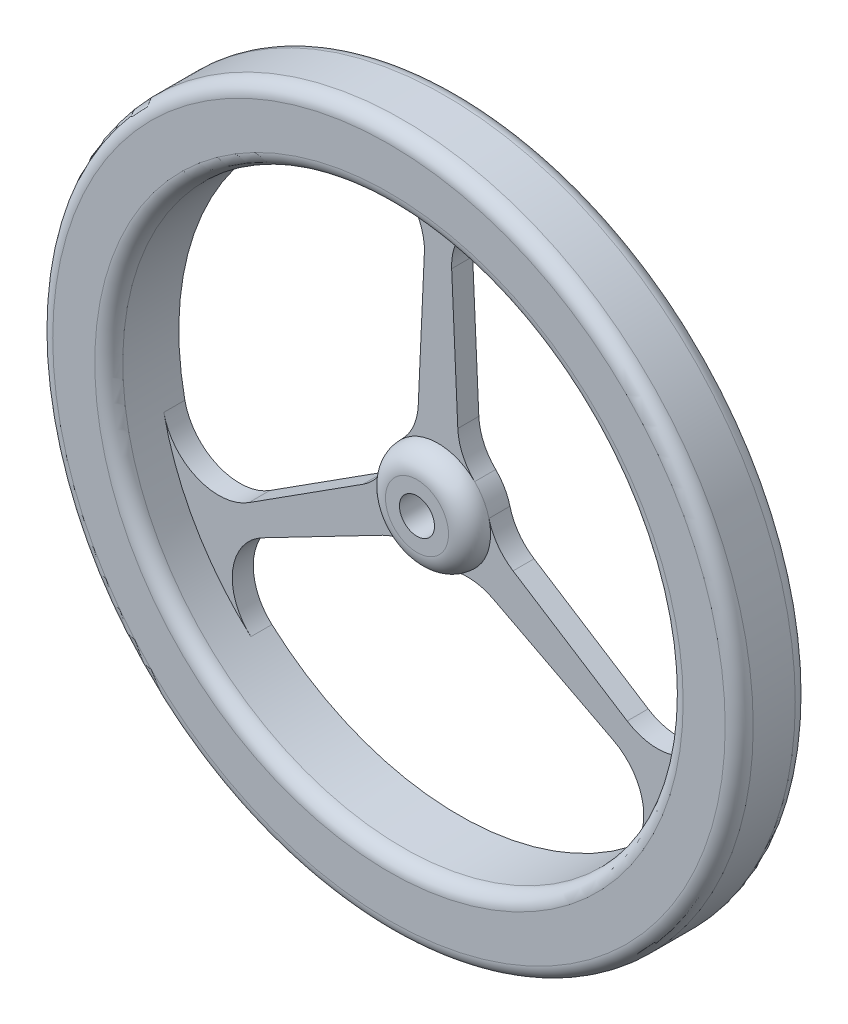
ISO-10303-21;
HEADER;
FILE_DESCRIPTION(('STEP AP214'),'2;1');
FILE_NAME('part.step','',(''),(''),'','','');
FILE_SCHEMA(('AUTOMOTIVE_DESIGN { 1 0 10303 214 1 1 1 1 }'));
ENDSEC;
DATA;
#1=APPLICATION_CONTEXT('core data for automotive mechanical design processes');
#2=APPLICATION_PROTOCOL_DEFINITION('international standard','automotive_design',2000,#1);
#3=PRODUCT_CONTEXT('',#1,'mechanical');
#4=PRODUCT('Part','Part','',(#3));
#5=PRODUCT_RELATED_PRODUCT_CATEGORY('part','',(#4));
#6=PRODUCT_DEFINITION_FORMATION('','',#4);
#7=PRODUCT_DEFINITION_CONTEXT('part definition',#1,'design');
#8=PRODUCT_DEFINITION('design','',#6,#7);
#9=PRODUCT_DEFINITION_SHAPE('','',#8);
#10=(LENGTH_UNIT() NAMED_UNIT(*) SI_UNIT(.MILLI.,.METRE.));
#11=(NAMED_UNIT(*) PLANE_ANGLE_UNIT() SI_UNIT($,.RADIAN.));
#12=(NAMED_UNIT(*) SI_UNIT($,.STERADIAN.) SOLID_ANGLE_UNIT());
#13=UNCERTAINTY_MEASURE_WITH_UNIT(LENGTH_MEASURE(1.E-05),#10,'distance_accuracy_value','');
#14=(GEOMETRIC_REPRESENTATION_CONTEXT(3) GLOBAL_UNCERTAINTY_ASSIGNED_CONTEXT((#13)) GLOBAL_UNIT_ASSIGNED_CONTEXT((#10,
#11,#12)) REPRESENTATION_CONTEXT('',''));
#15=CARTESIAN_POINT('',(0.,0.,0.));
#16=DIRECTION('',(0.,0.,1.));
#17=DIRECTION('',(1.,0.,0.));
#18=AXIS2_PLACEMENT_3D('',#15,#16,#17);
#19=CARTESIAN_POINT('',(0.,0.,6.));
#20=DIRECTION('',(0.,0.,-1.));
#21=DIRECTION('',(-1.,0.,0.));
#22=AXIS2_PLACEMENT_3D('',#19,#20,#21);
#23=CYLINDRICAL_SURFACE('',#22,7.5);
#24=DIRECTION('',(0.,0.,-1.));
#25=VECTOR('',#24,1.);
#26=CARTESIAN_POINT('',(2.03527367774959,-7.21856364221163,6.));
#27=LINE('',#26,#25);
#28=CARTESIAN_POINT('',(2.03527367774959,-7.21856364221163,0.));
#29=VERTEX_POINT('',#28);
#30=CARTESIAN_POINT('',(2.03527367774959,-7.21856364221163,3.));
#31=VERTEX_POINT('',#30);
#32=EDGE_CURVE('E321',#29,#31,#27,.F.);
#33=ORIENTED_EDGE('',*,*,#32,.T.);
#34=CARTESIAN_POINT('',(0.,0.,3.));
#35=DIRECTION('',(0.,0.,1.));
#36=DIRECTION('',(1.,0.,0.));
#37=AXIS2_PLACEMENT_3D('',#34,#35,#36);
#38=CIRCLE('',#37,7.5);
#39=CARTESIAN_POINT('',(-2.03527367774982,-7.21856364221157,3.));
#40=VERTEX_POINT('',#39);
#41=EDGE_CURVE('E388',#31,#40,#38,.F.);
#42=ORIENTED_EDGE('',*,*,#41,.T.);
#43=DIRECTION('',(0.,0.,-1.));
#44=VECTOR('',#43,1.);
#45=CARTESIAN_POINT('',(-2.03527367774982,-7.21856364221157,6.));
#46=LINE('',#45,#44);
#47=CARTESIAN_POINT('',(-2.03527367774982,-7.21856364221157,0.));
#48=VERTEX_POINT('',#47);
#49=EDGE_CURVE('E318',#40,#48,#46,.T.);
#50=ORIENTED_EDGE('',*,*,#49,.T.);
#51=CARTESIAN_POINT('',(0.,0.,0.));
#52=DIRECTION('',(0.,0.,1.));
#53=DIRECTION('',(1.,0.,0.));
#54=AXIS2_PLACEMENT_3D('',#51,#52,#53);
#55=CIRCLE('',#54,7.5);
#56=EDGE_CURVE('E252',#48,#29,#55,.T.);
#57=ORIENTED_EDGE('',*,*,#56,.T.);
#58=EDGE_LOOP('',(#33,#42,#50,#57));
#59=FACE_BOUND('',#58,.T.);
#60=ADVANCED_FACE('F41',(#59),#23,.T.);
#61=DIRECTION('',(0.,0.,-1.));
#62=VECTOR('',#61,1.);
#63=CARTESIAN_POINT('',(-7.2690963318648,1.84668311252085,6.));
#64=LINE('',#63,#62);
#65=CARTESIAN_POINT('',(-7.2690963318648,1.84668311252085,0.));
#66=VERTEX_POINT('',#65);
#67=CARTESIAN_POINT('',(-7.2690963318648,1.84668311252085,3.));
#68=VERTEX_POINT('',#67);
#69=EDGE_CURVE('E315',#66,#68,#64,.F.);
#70=ORIENTED_EDGE('',*,*,#69,.T.);
#71=CARTESIAN_POINT('',(0.,0.,3.));
#72=DIRECTION('',(0.,0.,1.));
#73=DIRECTION('',(1.,0.,0.));
#74=AXIS2_PLACEMENT_3D('',#71,#72,#73);
#75=CIRCLE('',#74,7.5);
#76=CARTESIAN_POINT('',(-5.2338226541151,5.37188052969084,3.));
#77=VERTEX_POINT('',#76);
#78=EDGE_CURVE('E386',#68,#77,#75,.F.);
#79=ORIENTED_EDGE('',*,*,#78,.T.);
#80=DIRECTION('',(0.,0.,-1.));
#81=VECTOR('',#80,1.);
#82=CARTESIAN_POINT('',(-5.2338226541151,5.37188052969084,6.));
#83=LINE('',#82,#81);
#84=CARTESIAN_POINT('',(-5.2338226541151,5.37188052969084,0.));
#85=VERTEX_POINT('',#84);
#86=EDGE_CURVE('E312',#77,#85,#83,.T.);
#87=ORIENTED_EDGE('',*,*,#86,.T.);
#88=EDGE_CURVE('E253',#85,#66,#55,.T.);
#89=ORIENTED_EDGE('',*,*,#88,.T.);
#90=EDGE_LOOP('',(#70,#79,#87,#89));
#91=FACE_BOUND('',#90,.T.);
#92=ADVANCED_FACE('F422',(#91),#23,.T.);
#93=CARTESIAN_POINT('',(0.,0.,10.));
#94=DIRECTION('',(0.,0.,1.));
#95=DIRECTION('',(1.,0.,0.));
#96=AXIS2_PLACEMENT_3D('',#93,#94,#95);
#97=PLANE('',#96);
#98=CARTESIAN_POINT('',(0.,0.,10.));
#99=DIRECTION('',(0.,0.,1.));
#100=DIRECTION('',(1.,0.,0.));
#101=AXIS2_PLACEMENT_3D('',#98,#99,#100);
#102=CIRCLE('',#101,48.);
#103=CARTESIAN_POINT('',(48.,0.,10.));
#104=VERTEX_POINT('',#103);
#105=EDGE_CURVE('E49',#104,#104,#102,.T.);
#106=ORIENTED_EDGE('',*,*,#105,.T.);
#107=EDGE_LOOP('',(#106));
#108=FACE_BOUND('',#107,.T.);
#109=CARTESIAN_POINT('',(0.,0.,10.));
#110=DIRECTION('',(0.,0.,1.));
#111=DIRECTION('',(1.,0.,0.));
#112=AXIS2_PLACEMENT_3D('',#109,#110,#111);
#113=CIRCLE('',#112,42.);
#114=CARTESIAN_POINT('',(42.,0.,10.));
#115=VERTEX_POINT('',#114);
#116=EDGE_CURVE('E400',#115,#115,#113,.F.);
#117=ORIENTED_EDGE('',*,*,#116,.T.);
#118=EDGE_LOOP('',(#117));
#119=FACE_BOUND('',#118,.T.);
#120=ADVANCED_FACE('F405',(#108,#119),#97,.T.);
#121=CARTESIAN_POINT('',(0.,0.,0.));
#122=DIRECTION('',(0.,0.,1.));
#123=DIRECTION('',(1.,0.,0.));
#124=AXIS2_PLACEMENT_3D('',#121,#122,#123);
#125=PLANE('',#124);
#126=CARTESIAN_POINT('',(0.,0.,0.));
#127=DIRECTION('',(0.,0.,1.));
#128=DIRECTION('',(1.,0.,0.));
#129=AXIS2_PLACEMENT_3D('',#126,#127,#128);
#130=CIRCLE('',#129,48.);
#131=CARTESIAN_POINT('',(48.,0.,0.));
#132=VERTEX_POINT('',#131);
#133=EDGE_CURVE('E397',#132,#132,#130,.F.);
#134=ORIENTED_EDGE('',*,*,#133,.T.);
#135=EDGE_LOOP('',(#134));
#136=FACE_BOUND('',#135,.T.);
#137=DIRECTION('',(0.887777804154205,0.460272278603805,0.));
#138=VECTOR('',#137,1.);
#139=CARTESIAN_POINT('',(1.52266404715864,-2.93692974156858,0.));
#140=LINE('',#139,#138);
#141=CARTESIAN_POINT('',(-25.0532731793852,-16.715340427277,0.));
#142=VERTEX_POINT('',#141);
#143=CARTESIAN_POINT('',(-7.88841049618007,-7.81614242733693,0.));
#144=VERTEX_POINT('',#143);
#145=EDGE_CURVE('E531',#142,#144,#140,.T.);
#146=ORIENTED_EDGE('',*,*,#145,.F.);
#147=CARTESIAN_POINT('',(-21.3710949505548,-23.8175628605106,0.));
#148=DIRECTION('',(0.,0.,1.));
#149=DIRECTION('',(1.,0.,0.));
#150=AXIS2_PLACEMENT_3D('',#147,#148,#149);
#151=CIRCLE('',#150,8.);
#152=CARTESIAN_POINT('',(-26.7138686881934,-29.7719535756382,0.));
#153=VERTEX_POINT('',#152);
#154=EDGE_CURVE('E338',#142,#153,#151,.T.);
#155=ORIENTED_EDGE('',*,*,#154,.T.);
#156=CARTESIAN_POINT('',(0.,0.,0.));
#157=DIRECTION('',(0.,0.,1.));
#158=DIRECTION('',(1.,0.,0.));
#159=AXIS2_PLACEMENT_3D('',#156,#157,#158);
#160=CIRCLE('',#159,40.);
#161=CARTESIAN_POINT('',(26.7138686881928,-29.7719535756388,0.));
#162=VERTEX_POINT('',#161);
#163=EDGE_CURVE('E271',#153,#162,#160,.T.);
#164=ORIENTED_EDGE('',*,*,#163,.T.);
#165=CARTESIAN_POINT('',(21.3710949505543,-23.817562860511,0.));
#166=DIRECTION('',(0.,0.,1.));
#167=DIRECTION('',(1.,0.,0.));
#168=AXIS2_PLACEMENT_3D('',#165,#166,#167);
#169=CIRCLE('',#168,8.);
#170=CARTESIAN_POINT('',(25.0532731793848,-16.7153404272774,0.));
#171=VERTEX_POINT('',#170);
#172=EDGE_CURVE('E333',#162,#171,#169,.T.);
#173=ORIENTED_EDGE('',*,*,#172,.T.);
#174=DIRECTION('',(-0.887777804154199,0.460272278603817,0.));
#175=VECTOR('',#174,1.);
#176=CARTESIAN_POINT('',(-1.52266404715877,-2.93692974156873,0.));
#177=LINE('',#176,#175);
#178=CARTESIAN_POINT('',(7.88841049617969,-7.81614242733712,0.));
#179=VERTEX_POINT('',#178);
#180=EDGE_CURVE('E233',#171,#179,#177,.T.);
#181=ORIENTED_EDGE('',*,*,#180,.T.);
#182=CARTESIAN_POINT('',(4.20623226734915,-14.9183648605707,0.));
#183=DIRECTION('',(0.,0.,1.));
#184=DIRECTION('',(1.,0.,0.));
#185=AXIS2_PLACEMENT_3D('',#182,#183,#184);
#186=CIRCLE('',#185,8.);
#187=EDGE_CURVE('E347',#179,#29,#186,.T.);
#188=ORIENTED_EDGE('',*,*,#187,.T.);
#189=ORIENTED_EDGE('',*,*,#56,.F.);
#190=CARTESIAN_POINT('',(-4.20623226734963,-14.9183648605706,0.));
#191=DIRECTION('',(0.,0.,1.));
#192=DIRECTION('',(1.,0.,0.));
#193=AXIS2_PLACEMENT_3D('',#190,#191,#192);
#194=CIRCLE('',#193,8.);
#195=EDGE_CURVE('E351',#48,#144,#194,.T.);
#196=ORIENTED_EDGE('',*,*,#195,.T.);
#197=EDGE_LOOP('',(#146,#155,#164,#173,#181,#188,#189,#196));
#198=FACE_BOUND('',#197,.T.);
#199=DIRECTION('',(-0.842496388005733,0.538701992011626,0.));
#200=VECTOR('',#199,1.);
#201=CARTESIAN_POINT('',(1.78212374174931,2.78713061705303,0.));
#202=LINE('',#201,#200);
#203=CARTESIAN_POINT('',(27.0025460326192,-13.3391008076609,0.));
#204=VERTEX_POINT('',#203);
#205=CARTESIAN_POINT('',(10.713183149761,-2.92349267150326,0.));
#206=VERTEX_POINT('',#205);
#207=EDGE_CURVE('E221',#204,#206,#202,.T.);
#208=ORIENTED_EDGE('',*,*,#207,.F.);
#209=CARTESIAN_POINT('',(31.3121619687122,-6.59912970361502,0.));
#210=DIRECTION('',(0.,0.,1.));
#211=DIRECTION('',(1.,0.,0.));
#212=AXIS2_PLACEMENT_3D('',#209,#210,#211);
#213=CIRCLE('',#212,8.);
#214=CARTESIAN_POINT('',(39.1402024608902,-8.24891212951877,0.));
#215=VERTEX_POINT('',#214);
#216=EDGE_CURVE('E203',#204,#215,#213,.T.);
#217=ORIENTED_EDGE('',*,*,#216,.T.);
#218=CARTESIAN_POINT('',(12.426333772697,38.0208657051563,0.));
#219=VERTEX_POINT('',#218);
#220=EDGE_CURVE('E265',#215,#219,#160,.T.);
#221=ORIENTED_EDGE('',*,*,#220,.T.);
#222=CARTESIAN_POINT('',(9.94106701815758,30.416692564125,0.));
#223=DIRECTION('',(0.,0.,1.));
#224=DIRECTION('',(1.,0.,0.));
#225=AXIS2_PLACEMENT_3D('',#222,#223,#224);
#226=CIRCLE('',#225,8.);
#227=CARTESIAN_POINT('',(1.9492728532343,30.0544412349373,0.));
#228=VERTEX_POINT('',#227);
#229=EDGE_CURVE('E372',#219,#228,#226,.T.);
#230=ORIENTED_EDGE('',*,*,#229,.T.);
#231=DIRECTION('',(0.0452814161484647,-0.99897427061541,0.));
#232=VECTOR('',#231,1.);
#233=CARTESIAN_POINT('',(3.30478778890798,0.149799124515708,0.));
#234=LINE('',#233,#232);
#235=CARTESIAN_POINT('',(2.82477265358127,10.73963509884,0.));
#236=VERTEX_POINT('',#235);
#237=EDGE_CURVE('E266',#228,#236,#234,.T.);
#238=ORIENTED_EDGE('',*,*,#237,.T.);
#239=CARTESIAN_POINT('',(10.8165668185045,11.1018864280277,0.));
#240=DIRECTION('',(0.,0.,1.));
#241=DIRECTION('',(1.,0.,0.));
#242=AXIS2_PLACEMENT_3D('',#239,#240,#241);
#243=CIRCLE('',#242,8.);
#244=CARTESIAN_POINT('',(5.2338226541151,5.37188052969084,0.));
#245=VERTEX_POINT('',#244);
#246=EDGE_CURVE('E369',#236,#245,#243,.T.);
#247=ORIENTED_EDGE('',*,*,#246,.T.);
#248=CARTESIAN_POINT('',(7.26909633186486,1.84668311252061,0.));
#249=VERTEX_POINT('',#248);
#250=EDGE_CURVE('E246',#249,#245,#55,.T.);
#251=ORIENTED_EDGE('',*,*,#250,.F.);
#252=CARTESIAN_POINT('',(15.022799085854,3.8164784325426,0.));
#253=DIRECTION('',(0.,0.,1.));
#254=DIRECTION('',(1.,0.,0.));
#255=AXIS2_PLACEMENT_3D('',#252,#253,#254);
#256=CIRCLE('',#255,8.);
#257=EDGE_CURVE('E231',#249,#206,#256,.T.);
#258=ORIENTED_EDGE('',*,*,#257,.T.);
#259=EDGE_LOOP('',(#208,#217,#221,#230,#238,#247,#251,#258));
#260=FACE_BOUND('',#259,.T.);
#261=DIRECTION('',(-0.0452814161484647,-0.99897427061541,0.));
#262=VECTOR('',#261,1.);
#263=CARTESIAN_POINT('',(-3.30478778890798,0.149799124515708,0.));
#264=LINE('',#263,#262);
#265=CARTESIAN_POINT('',(-1.9492728532343,30.0544412349373,0.));
#266=VERTEX_POINT('',#265);
#267=CARTESIAN_POINT('',(-2.82477265358127,10.73963509884,0.));
#268=VERTEX_POINT('',#267);
#269=EDGE_CURVE('E258',#266,#268,#264,.T.);
#270=ORIENTED_EDGE('',*,*,#269,.F.);
#271=CARTESIAN_POINT('',(-9.94106701815758,30.416692564125,0.));
#272=DIRECTION('',(0.,0.,1.));
#273=DIRECTION('',(1.,0.,0.));
#274=AXIS2_PLACEMENT_3D('',#271,#272,#273);
#275=CIRCLE('',#274,8.);
#276=CARTESIAN_POINT('',(-12.426333772697,38.0208657051563,0.));
#277=VERTEX_POINT('',#276);
#278=EDGE_CURVE('E377',#266,#277,#275,.T.);
#279=ORIENTED_EDGE('',*,*,#278,.T.);
#280=CARTESIAN_POINT('',(-39.1402024608904,-8.24891212951799,0.));
#281=VERTEX_POINT('',#280);
#282=EDGE_CURVE('E274',#277,#281,#160,.T.);
#283=ORIENTED_EDGE('',*,*,#282,.T.);
#284=CARTESIAN_POINT('',(-31.3121619687123,-6.59912970361439,0.));
#285=DIRECTION('',(0.,0.,1.));
#286=DIRECTION('',(1.,0.,0.));
#287=AXIS2_PLACEMENT_3D('',#284,#285,#286);
#288=CIRCLE('',#287,8.);
#289=CARTESIAN_POINT('',(-27.0025460326194,-13.3391008076603,0.));
#290=VERTEX_POINT('',#289);
#291=EDGE_CURVE('E342',#281,#290,#288,.T.);
#292=ORIENTED_EDGE('',*,*,#291,.T.);
#293=DIRECTION('',(0.84249638800574,0.538701992011614,0.));
#294=VECTOR('',#293,1.);
#295=CARTESIAN_POINT('',(-1.78212374174938,2.78713061705322,0.));
#296=LINE('',#295,#294);
#297=CARTESIAN_POINT('',(-10.713183149761,-2.92349267150284,0.));
#298=VERTEX_POINT('',#297);
#299=EDGE_CURVE('E514',#290,#298,#296,.T.);
#300=ORIENTED_EDGE('',*,*,#299,.T.);
#301=CARTESIAN_POINT('',(-15.0227990858539,3.81647843254309,0.));
#302=DIRECTION('',(0.,0.,1.));
#303=DIRECTION('',(1.,0.,0.));
#304=AXIS2_PLACEMENT_3D('',#301,#302,#303);
#305=CIRCLE('',#304,8.);
#306=EDGE_CURVE('E356',#298,#66,#305,.T.);
#307=ORIENTED_EDGE('',*,*,#306,.T.);
#308=ORIENTED_EDGE('',*,*,#88,.F.);
#309=CARTESIAN_POINT('',(-10.8165668185045,11.1018864280277,0.));
#310=DIRECTION('',(0.,0.,1.));
#311=DIRECTION('',(1.,0.,0.));
#312=AXIS2_PLACEMENT_3D('',#309,#310,#311);
#313=CIRCLE('',#312,8.);
#314=EDGE_CURVE('E360',#85,#268,#313,.T.);
#315=ORIENTED_EDGE('',*,*,#314,.T.);
#316=EDGE_LOOP('',(#270,#279,#283,#292,#300,#307,#308,#315));
#317=FACE_BOUND('',#316,.T.);
#318=CARTESIAN_POINT('',(0.,0.,0.));
#319=DIRECTION('',(0.,0.,1.));
#320=DIRECTION('',(1.,0.,0.));
#321=AXIS2_PLACEMENT_3D('',#318,#319,#320);
#322=CIRCLE('',#321,2.5);
#323=CARTESIAN_POINT('',(2.5,0.,0.));
#324=VERTEX_POINT('',#323);
#325=EDGE_CURVE('E247',#324,#324,#322,.T.);
#326=ORIENTED_EDGE('',*,*,#325,.T.);
#327=EDGE_LOOP('',(#326));
#328=FACE_BOUND('',#327,.T.);
#329=ADVANCED_FACE('F228',(#136,#198,#260,#317,#328),#125,.F.);
#330=CARTESIAN_POINT('',(0.,0.,10.));
#331=DIRECTION('',(0.,0.,-1.));
#332=DIRECTION('',(-1.,0.,0.));
#333=AXIS2_PLACEMENT_3D('',#330,#331,#332);
#334=CYLINDRICAL_SURFACE('',#333,50.);
#335=CARTESIAN_POINT('',(0.,0.,2.));
#336=DIRECTION('',(0.,0.,1.));
#337=DIRECTION('',(1.,0.,0.));
#338=AXIS2_PLACEMENT_3D('',#335,#336,#337);
#339=CIRCLE('',#338,50.);
#340=CARTESIAN_POINT('',(50.,0.,2.));
#341=VERTEX_POINT('',#340);
#342=EDGE_CURVE('E394',#341,#341,#339,.T.);
#343=ORIENTED_EDGE('',*,*,#342,.T.);
#344=EDGE_LOOP('',(#343));
#345=FACE_BOUND('',#344,.T.);
#346=CARTESIAN_POINT('',(0.,0.,8.));
#347=DIRECTION('',(0.,0.,1.));
#348=DIRECTION('',(1.,0.,0.));
#349=AXIS2_PLACEMENT_3D('',#346,#347,#348);
#350=CIRCLE('',#349,50.);
#351=CARTESIAN_POINT('',(50.,0.,8.));
#352=VERTEX_POINT('',#351);
#353=EDGE_CURVE('E391',#352,#352,#350,.F.);
#354=ORIENTED_EDGE('',*,*,#353,.T.);
#355=EDGE_LOOP('',(#354));
#356=FACE_BOUND('',#355,.T.);
#357=ADVANCED_FACE('F606',(#345,#356),#334,.T.);
#358=CARTESIAN_POINT('',(0.,0.,10.));
#359=DIRECTION('',(0.,0.,-1.));
#360=DIRECTION('',(-1.,0.,0.));
#361=AXIS2_PLACEMENT_3D('',#358,#359,#360);
#362=CYLINDRICAL_SURFACE('',#361,40.);
#363=CARTESIAN_POINT('',(0.,0.,8.));
#364=DIRECTION('',(0.,0.,1.));
#365=DIRECTION('',(1.,0.,0.));
#366=AXIS2_PLACEMENT_3D('',#363,#364,#365);
#367=CIRCLE('',#366,40.);
#368=CARTESIAN_POINT('',(40.,0.,8.));
#369=VERTEX_POINT('',#368);
#370=EDGE_CURVE('E12',#369,#369,#367,.T.);
#371=ORIENTED_EDGE('',*,*,#370,.T.);
#372=EDGE_LOOP('',(#371));
#373=FACE_BOUND('',#372,.T.);
#374=ORIENTED_EDGE('',*,*,#220,.F.);
#375=DIRECTION('',(0.,0.,-1.));
#376=VECTOR('',#375,1.);
#377=CARTESIAN_POINT('',(39.1402024608902,-8.24891212951878,10.));
#378=LINE('',#377,#376);
#379=CARTESIAN_POINT('',(39.1402024608902,-8.24891212951877,3.));
#380=VERTEX_POINT('',#379);
#381=EDGE_CURVE('E209',#215,#380,#378,.F.);
#382=ORIENTED_EDGE('',*,*,#381,.T.);
#383=CARTESIAN_POINT('',(0.,0.,3.));
#384=DIRECTION('',(0.,0.,1.));
#385=DIRECTION('',(1.,0.,0.));
#386=AXIS2_PLACEMENT_3D('',#383,#384,#385);
#387=CIRCLE('',#386,40.);
#388=CARTESIAN_POINT('',(26.7138686881928,-29.7719535756388,3.));
#389=VERTEX_POINT('',#388);
#390=EDGE_CURVE('E480',#389,#380,#387,.T.);
#391=ORIENTED_EDGE('',*,*,#390,.F.);
#392=DIRECTION('',(0.,0.,-1.));
#393=VECTOR('',#392,1.);
#394=CARTESIAN_POINT('',(26.7138686881928,-29.7719535756388,10.));
#395=LINE('',#394,#393);
#396=EDGE_CURVE('E287',#389,#162,#395,.T.);
#397=ORIENTED_EDGE('',*,*,#396,.T.);
#398=ORIENTED_EDGE('',*,*,#163,.F.);
#399=DIRECTION('',(0.,0.,-1.));
#400=VECTOR('',#399,1.);
#401=CARTESIAN_POINT('',(-26.7138686881934,-29.7719535756382,10.));
#402=LINE('',#401,#400);
#403=CARTESIAN_POINT('',(-26.7138686881934,-29.7719535756382,3.));
#404=VERTEX_POINT('',#403);
#405=EDGE_CURVE('E284',#153,#404,#402,.F.);
#406=ORIENTED_EDGE('',*,*,#405,.T.);
#407=CARTESIAN_POINT('',(0.,0.,3.));
#408=DIRECTION('',(0.,0.,1.));
#409=DIRECTION('',(1.,0.,0.));
#410=AXIS2_PLACEMENT_3D('',#407,#408,#409);
#411=CIRCLE('',#410,40.);
#412=CARTESIAN_POINT('',(-39.1402024608904,-8.24891212951799,3.));
#413=VERTEX_POINT('',#412);
#414=EDGE_CURVE('E527',#413,#404,#411,.T.);
#415=ORIENTED_EDGE('',*,*,#414,.F.);
#416=DIRECTION('',(0.,0.,-1.));
#417=VECTOR('',#416,1.);
#418=CARTESIAN_POINT('',(-39.1402024608904,-8.24891212951799,10.));
#419=LINE('',#418,#417);
#420=EDGE_CURVE('E281',#413,#281,#419,.T.);
#421=ORIENTED_EDGE('',*,*,#420,.T.);
#422=ORIENTED_EDGE('',*,*,#282,.F.);
#423=DIRECTION('',(0.,0.,-1.));
#424=VECTOR('',#423,1.);
#425=CARTESIAN_POINT('',(-12.426333772697,38.0208657051563,10.));
#426=LINE('',#425,#424);
#427=CARTESIAN_POINT('',(-12.426333772697,38.0208657051563,3.));
#428=VERTEX_POINT('',#427);
#429=EDGE_CURVE('E225',#277,#428,#426,.F.);
#430=ORIENTED_EDGE('',*,*,#429,.T.);
#431=CARTESIAN_POINT('',(0.,0.,3.));
#432=DIRECTION('',(0.,0.,1.));
#433=DIRECTION('',(1.,0.,0.));
#434=AXIS2_PLACEMENT_3D('',#431,#432,#433);
#435=CIRCLE('',#434,40.);
#436=CARTESIAN_POINT('',(12.426333772697,38.0208657051563,3.));
#437=VERTEX_POINT('',#436);
#438=EDGE_CURVE('E260',#437,#428,#435,.T.);
#439=ORIENTED_EDGE('',*,*,#438,.F.);
#440=DIRECTION('',(0.,0.,-1.));
#441=VECTOR('',#440,1.);
#442=CARTESIAN_POINT('',(12.426333772697,38.0208657051563,10.));
#443=LINE('',#442,#441);
#444=EDGE_CURVE('E278',#437,#219,#443,.T.);
#445=ORIENTED_EDGE('',*,*,#444,.T.);
#446=EDGE_LOOP('',(#374,#382,#391,#397,#398,#406,#415,#421,#422,#430,#439,#445));
#447=FACE_BOUND('',#446,.T.);
#448=ADVANCED_FACE('F478',(#373,#447),#362,.F.);
#449=CARTESIAN_POINT('',(3.30478778890798,0.149799124515708,3.));
#450=DIRECTION('',(0.99897427061541,0.0452814161484647,0.));
#451=DIRECTION('',(-0.0452814161484647,0.99897427061541,0.));
#452=AXIS2_PLACEMENT_3D('',#449,#450,#451);
#453=PLANE('',#452);
#454=DIRECTION('',(0.0452814161484647,-0.99897427061541,0.));
#455=VECTOR('',#454,1.);
#456=CARTESIAN_POINT('',(3.30478778890798,0.149799124515708,3.));
#457=LINE('',#456,#455);
#458=CARTESIAN_POINT('',(1.9492728532343,30.0544412349373,3.));
#459=VERTEX_POINT('',#458);
#460=CARTESIAN_POINT('',(2.82477265358127,10.73963509884,3.));
#461=VERTEX_POINT('',#460);
#462=EDGE_CURVE('E257',#459,#461,#457,.T.);
#463=ORIENTED_EDGE('',*,*,#462,.T.);
#464=DIRECTION('',(0.,0.,-1.));
#465=VECTOR('',#464,1.);
#466=CARTESIAN_POINT('',(2.82477265358127,10.73963509884,3.));
#467=LINE('',#466,#465);
#468=EDGE_CURVE('E215',#461,#236,#467,.T.);
#469=ORIENTED_EDGE('',*,*,#468,.T.);
#470=ORIENTED_EDGE('',*,*,#237,.F.);
#471=DIRECTION('',(0.,0.,1.));
#472=VECTOR('',#471,1.);
#473=CARTESIAN_POINT('',(1.9492728532343,30.0544412349373,3.));
#474=LINE('',#473,#472);
#475=EDGE_CURVE('E63',#228,#459,#474,.T.);
#476=ORIENTED_EDGE('',*,*,#475,.T.);
#477=EDGE_LOOP('',(#463,#469,#470,#476));
#478=FACE_BOUND('',#477,.T.);
#479=ADVANCED_FACE('F486',(#478),#453,.T.);
#480=CARTESIAN_POINT('',(-3.30478778890798,0.149799124515708,3.));
#481=DIRECTION('',(0.99897427061541,-0.0452814161484647,0.));
#482=DIRECTION('',(0.0452814161484647,0.99897427061541,0.));
#483=AXIS2_PLACEMENT_3D('',#480,#481,#482);
#484=PLANE('',#483);
#485=ORIENTED_EDGE('',*,*,#269,.T.);
#486=DIRECTION('',(0.,0.,1.));
#487=VECTOR('',#486,1.);
#488=CARTESIAN_POINT('',(-2.82477265358126,10.73963509884,3.));
#489=LINE('',#488,#487);
#490=CARTESIAN_POINT('',(-2.82477265358127,10.73963509884,3.));
#491=VERTEX_POINT('',#490);
#492=EDGE_CURVE('E327',#268,#491,#489,.T.);
#493=ORIENTED_EDGE('',*,*,#492,.T.);
#494=DIRECTION('',(-0.0452814161484647,-0.99897427061541,0.));
#495=VECTOR('',#494,1.);
#496=CARTESIAN_POINT('',(-3.30478778890798,0.149799124515708,3.));
#497=LINE('',#496,#495);
#498=CARTESIAN_POINT('',(-1.9492728532343,30.0544412349373,3.));
#499=VERTEX_POINT('',#498);
#500=EDGE_CURVE('E262',#499,#491,#497,.T.);
#501=ORIENTED_EDGE('',*,*,#500,.F.);
#502=DIRECTION('',(0.,0.,-1.));
#503=VECTOR('',#502,1.);
#504=CARTESIAN_POINT('',(-1.94927285323431,30.0544412349373,3.));
#505=LINE('',#504,#503);
#506=EDGE_CURVE('E324',#499,#266,#505,.T.);
#507=ORIENTED_EDGE('',*,*,#506,.T.);
#508=EDGE_LOOP('',(#485,#493,#501,#507));
#509=FACE_BOUND('',#508,.T.);
#510=ADVANCED_FACE('F506',(#509),#484,.F.);
#511=CARTESIAN_POINT('',(0.,0.,3.));
#512=DIRECTION('',(0.,0.,1.));
#513=DIRECTION('',(1.,0.,0.));
#514=AXIS2_PLACEMENT_3D('',#511,#512,#513);
#515=PLANE('',#514);
#516=CARTESIAN_POINT('',(0.,0.,3.));
#517=DIRECTION('',(0.,0.,1.));
#518=DIRECTION('',(1.,0.,0.));
#519=AXIS2_PLACEMENT_3D('',#516,#517,#518);
#520=CIRCLE('',#519,7.5);
#521=CARTESIAN_POINT('',(5.2338226541151,5.37188052969084,3.));
#522=VERTEX_POINT('',#521);
#523=EDGE_CURVE('E254',#522,#77,#520,.T.);
#524=ORIENTED_EDGE('',*,*,#523,.F.);
#525=CARTESIAN_POINT('',(10.8165668185045,11.1018864280277,3.));
#526=DIRECTION('',(0.,0.,1.));
#527=DIRECTION('',(1.,0.,0.));
#528=AXIS2_PLACEMENT_3D('',#525,#526,#527);
#529=CIRCLE('',#528,8.);
#530=EDGE_CURVE('E56',#522,#461,#529,.F.);
#531=ORIENTED_EDGE('',*,*,#530,.T.);
#532=ORIENTED_EDGE('',*,*,#462,.F.);
#533=CARTESIAN_POINT('',(9.94106701815758,30.416692564125,3.));
#534=DIRECTION('',(0.,0.,1.));
#535=DIRECTION('',(1.,0.,0.));
#536=AXIS2_PLACEMENT_3D('',#533,#534,#535);
#537=CIRCLE('',#536,8.);
#538=EDGE_CURVE('E374',#459,#437,#537,.F.);
#539=ORIENTED_EDGE('',*,*,#538,.T.);
#540=ORIENTED_EDGE('',*,*,#438,.T.);
#541=CARTESIAN_POINT('',(-9.94106701815758,30.416692564125,3.));
#542=DIRECTION('',(0.,0.,1.));
#543=DIRECTION('',(1.,0.,0.));
#544=AXIS2_PLACEMENT_3D('',#541,#542,#543);
#545=CIRCLE('',#544,8.);
#546=EDGE_CURVE('E379',#428,#499,#545,.F.);
#547=ORIENTED_EDGE('',*,*,#546,.T.);
#548=ORIENTED_EDGE('',*,*,#500,.T.);
#549=CARTESIAN_POINT('',(-10.8165668185045,11.1018864280277,3.));
#550=DIRECTION('',(0.,0.,1.));
#551=DIRECTION('',(1.,0.,0.));
#552=AXIS2_PLACEMENT_3D('',#549,#550,#551);
#553=CIRCLE('',#552,8.);
#554=EDGE_CURVE('E362',#491,#77,#553,.F.);
#555=ORIENTED_EDGE('',*,*,#554,.T.);
#556=EDGE_LOOP('',(#524,#531,#532,#539,#540,#547,#548,#555));
#557=FACE_BOUND('',#556,.T.);
#558=ADVANCED_FACE('F443',(#557),#515,.T.);
#559=CARTESIAN_POINT('',(0.,0.,6.));
#560=DIRECTION('',(0.,0.,1.));
#561=DIRECTION('',(1.,0.,0.));
#562=AXIS2_PLACEMENT_3D('',#559,#560,#561);
#563=PLANE('',#562);
#564=CARTESIAN_POINT('',(0.,0.,6.));
#565=DIRECTION('',(0.,0.,1.));
#566=DIRECTION('',(1.,0.,0.));
#567=AXIS2_PLACEMENT_3D('',#564,#565,#566);
#568=CIRCLE('',#567,4.5);
#569=CARTESIAN_POINT('',(4.5,0.,6.));
#570=VERTEX_POINT('',#569);
#571=EDGE_CURVE('E381',#570,#570,#568,.T.);
#572=ORIENTED_EDGE('',*,*,#571,.T.);
#573=EDGE_LOOP('',(#572));
#574=FACE_BOUND('',#573,.T.);
#575=CARTESIAN_POINT('',(0.,0.,6.));
#576=DIRECTION('',(0.,0.,1.));
#577=DIRECTION('',(1.,0.,0.));
#578=AXIS2_PLACEMENT_3D('',#575,#576,#577);
#579=CIRCLE('',#578,2.5);
#580=CARTESIAN_POINT('',(2.5,0.,6.));
#581=VERTEX_POINT('',#580);
#582=EDGE_CURVE('E243',#581,#581,#579,.T.);
#583=ORIENTED_EDGE('',*,*,#582,.F.);
#584=EDGE_LOOP('',(#583));
#585=FACE_BOUND('',#584,.T.);
#586=ADVANCED_FACE('F434',(#574,#585),#563,.T.);
#587=DIRECTION('',(0.,0.,-1.));
#588=VECTOR('',#587,1.);
#589=CARTESIAN_POINT('',(5.2338226541151,5.37188052969084,6.));
#590=LINE('',#589,#588);
#591=EDGE_CURVE('E306',#245,#522,#590,.F.);
#592=ORIENTED_EDGE('',*,*,#591,.T.);
#593=CARTESIAN_POINT('',(0.,0.,3.));
#594=DIRECTION('',(0.,0.,1.));
#595=DIRECTION('',(1.,0.,0.));
#596=AXIS2_PLACEMENT_3D('',#593,#594,#595);
#597=CIRCLE('',#596,7.5);
#598=CARTESIAN_POINT('',(7.26909633186486,1.84668311252061,3.));
#599=VERTEX_POINT('',#598);
#600=EDGE_CURVE('E384',#522,#599,#597,.F.);
#601=ORIENTED_EDGE('',*,*,#600,.T.);
#602=DIRECTION('',(0.,0.,-1.));
#603=VECTOR('',#602,1.);
#604=CARTESIAN_POINT('',(7.26909633186486,1.84668311252061,6.));
#605=LINE('',#604,#603);
#606=EDGE_CURVE('E309',#599,#249,#605,.T.);
#607=ORIENTED_EDGE('',*,*,#606,.T.);
#608=ORIENTED_EDGE('',*,*,#250,.T.);
#609=EDGE_LOOP('',(#592,#601,#607,#608));
#610=FACE_BOUND('',#609,.T.);
#611=ADVANCED_FACE('F425',(#610),#23,.T.);
#612=CARTESIAN_POINT('',(0.,0.,6.));
#613=DIRECTION('',(0.,0.,-1.));
#614=DIRECTION('',(-1.,0.,0.));
#615=AXIS2_PLACEMENT_3D('',#612,#613,#614);
#616=CYLINDRICAL_SURFACE('',#615,2.5);
#617=ORIENTED_EDGE('',*,*,#582,.T.);
#618=EDGE_LOOP('',(#617));
#619=FACE_BOUND('',#618,.T.);
#620=ORIENTED_EDGE('',*,*,#325,.F.);
#621=EDGE_LOOP('',(#620));
#622=FACE_BOUND('',#621,.T.);
#623=ADVANCED_FACE('F433',(#619,#622),#616,.F.);
#624=CARTESIAN_POINT('',(-1.52266404715877,-2.93692974156873,3.));
#625=DIRECTION('',(-0.460272278603817,-0.887777804154198,0.));
#626=DIRECTION('',(0.887777804154199,-0.460272278603817,0.));
#627=AXIS2_PLACEMENT_3D('',#624,#625,#626);
#628=PLANE('',#627);
#629=ORIENTED_EDGE('',*,*,#180,.F.);
#630=DIRECTION('',(0.,0.,1.));
#631=VECTOR('',#630,1.);
#632=CARTESIAN_POINT('',(25.0532731793848,-16.7153404272774,3.));
#633=LINE('',#632,#631);
#634=CARTESIAN_POINT('',(25.0532731793848,-16.7153404272774,3.));
#635=VERTEX_POINT('',#634);
#636=EDGE_CURVE('E294',#171,#635,#633,.T.);
#637=ORIENTED_EDGE('',*,*,#636,.T.);
#638=DIRECTION('',(-0.887777804154199,0.460272278603817,0.));
#639=VECTOR('',#638,1.);
#640=CARTESIAN_POINT('',(-1.52266404715877,-2.93692974156873,3.));
#641=LINE('',#640,#639);
#642=CARTESIAN_POINT('',(7.88841049617969,-7.81614242733712,3.));
#643=VERTEX_POINT('',#642);
#644=EDGE_CURVE('E236',#635,#643,#641,.T.);
#645=ORIENTED_EDGE('',*,*,#644,.T.);
#646=DIRECTION('',(0.,0.,-1.));
#647=VECTOR('',#646,1.);
#648=CARTESIAN_POINT('',(7.88841049617969,-7.81614242733712,3.));
#649=LINE('',#648,#647);
#650=EDGE_CURVE('E291',#643,#179,#649,.T.);
#651=ORIENTED_EDGE('',*,*,#650,.T.);
#652=EDGE_LOOP('',(#629,#637,#645,#651));
#653=FACE_BOUND('',#652,.T.);
#654=ADVANCED_FACE('F440',(#653),#628,.T.);
#655=CARTESIAN_POINT('',(1.78212374174931,2.78713061705303,3.));
#656=DIRECTION('',(-0.538701992011626,-0.842496388005733,0.));
#657=DIRECTION('',(0.842496388005733,-0.538701992011626,0.));
#658=AXIS2_PLACEMENT_3D('',#655,#656,#657);
#659=PLANE('',#658);
#660=DIRECTION('',(-0.842496388005733,0.538701992011626,0.));
#661=VECTOR('',#660,1.);
#662=CARTESIAN_POINT('',(1.78212374174931,2.78713061705303,3.));
#663=LINE('',#662,#661);
#664=CARTESIAN_POINT('',(27.0025460326192,-13.3391008076609,3.));
#665=VERTEX_POINT('',#664);
#666=CARTESIAN_POINT('',(10.713183149761,-2.92349267150326,3.));
#667=VERTEX_POINT('',#666);
#668=EDGE_CURVE('E224',#665,#667,#663,.T.);
#669=ORIENTED_EDGE('',*,*,#668,.F.);
#670=DIRECTION('',(0.,0.,-1.));
#671=VECTOR('',#670,1.);
#672=CARTESIAN_POINT('',(27.0025460326192,-13.3391008076609,3.));
#673=LINE('',#672,#671);
#674=EDGE_CURVE('E207',#665,#204,#673,.T.);
#675=ORIENTED_EDGE('',*,*,#674,.T.);
#676=ORIENTED_EDGE('',*,*,#207,.T.);
#677=DIRECTION('',(0.,0.,1.));
#678=VECTOR('',#677,1.);
#679=CARTESIAN_POINT('',(10.713183149761,-2.92349267150326,3.));
#680=LINE('',#679,#678);
#681=EDGE_CURVE('E226',#206,#667,#680,.T.);
#682=ORIENTED_EDGE('',*,*,#681,.T.);
#683=EDGE_LOOP('',(#669,#675,#676,#682));
#684=FACE_BOUND('',#683,.T.);
#685=ADVANCED_FACE('F220',(#684),#659,.F.);
#686=CARTESIAN_POINT('',(0.,0.,3.));
#687=DIRECTION('',(0.,0.,1.));
#688=DIRECTION('',(1.,0.,0.));
#689=AXIS2_PLACEMENT_3D('',#686,#687,#688);
#690=PLANE('',#689);
#691=CARTESIAN_POINT('',(0.,0.,3.));
#692=DIRECTION('',(0.,0.,1.));
#693=DIRECTION('',(1.,0.,0.));
#694=AXIS2_PLACEMENT_3D('',#691,#692,#693);
#695=CIRCLE('',#694,7.5);
#696=EDGE_CURVE('E232',#31,#599,#695,.T.);
#697=ORIENTED_EDGE('',*,*,#696,.F.);
#698=CARTESIAN_POINT('',(4.20623226734915,-14.9183648605707,3.));
#699=DIRECTION('',(0.,0.,1.));
#700=DIRECTION('',(1.,0.,0.));
#701=AXIS2_PLACEMENT_3D('',#698,#699,#700);
#702=CIRCLE('',#701,8.);
#703=EDGE_CURVE('E349',#31,#643,#702,.F.);
#704=ORIENTED_EDGE('',*,*,#703,.T.);
#705=ORIENTED_EDGE('',*,*,#644,.F.);
#706=CARTESIAN_POINT('',(21.3710949505543,-23.817562860511,3.));
#707=DIRECTION('',(0.,0.,1.));
#708=DIRECTION('',(1.,0.,0.));
#709=AXIS2_PLACEMENT_3D('',#706,#707,#708);
#710=CIRCLE('',#709,8.);
#711=EDGE_CURVE('E335',#635,#389,#710,.F.);
#712=ORIENTED_EDGE('',*,*,#711,.T.);
#713=ORIENTED_EDGE('',*,*,#390,.T.);
#714=CARTESIAN_POINT('',(31.3121619687122,-6.59912970361502,3.));
#715=DIRECTION('',(0.,0.,1.));
#716=DIRECTION('',(1.,0.,0.));
#717=AXIS2_PLACEMENT_3D('',#714,#715,#716);
#718=CIRCLE('',#717,8.);
#719=EDGE_CURVE('E214',#380,#665,#718,.F.);
#720=ORIENTED_EDGE('',*,*,#719,.T.);
#721=ORIENTED_EDGE('',*,*,#668,.T.);
#722=CARTESIAN_POINT('',(15.022799085854,3.8164784325426,3.));
#723=DIRECTION('',(0.,0.,1.));
#724=DIRECTION('',(1.,0.,0.));
#725=AXIS2_PLACEMENT_3D('',#722,#723,#724);
#726=CIRCLE('',#725,8.);
#727=EDGE_CURVE('E366',#667,#599,#726,.F.);
#728=ORIENTED_EDGE('',*,*,#727,.T.);
#729=EDGE_LOOP('',(#697,#704,#705,#712,#713,#720,#721,#728));
#730=FACE_BOUND('',#729,.T.);
#731=ADVANCED_FACE('F455',(#730),#690,.T.);
#732=CARTESIAN_POINT('',(-1.78212374174938,2.78713061705322,3.));
#733=DIRECTION('',(-0.538701992011614,0.84249638800574,0.));
#734=DIRECTION('',(-0.84249638800574,-0.538701992011614,0.));
#735=AXIS2_PLACEMENT_3D('',#732,#733,#734);
#736=PLANE('',#735);
#737=ORIENTED_EDGE('',*,*,#299,.F.);
#738=DIRECTION('',(0.,0.,1.));
#739=VECTOR('',#738,1.);
#740=CARTESIAN_POINT('',(-27.0025460326194,-13.3391008076603,3.));
#741=LINE('',#740,#739);
#742=CARTESIAN_POINT('',(-27.0025460326194,-13.3391008076603,3.));
#743=VERTEX_POINT('',#742);
#744=EDGE_CURVE('E304',#290,#743,#741,.T.);
#745=ORIENTED_EDGE('',*,*,#744,.T.);
#746=DIRECTION('',(0.84249638800574,0.538701992011614,0.));
#747=VECTOR('',#746,1.);
#748=CARTESIAN_POINT('',(-1.78212374174938,2.78713061705322,3.));
#749=LINE('',#748,#747);
#750=CARTESIAN_POINT('',(-10.713183149761,-2.92349267150284,3.));
#751=VERTEX_POINT('',#750);
#752=EDGE_CURVE('E524',#743,#751,#749,.T.);
#753=ORIENTED_EDGE('',*,*,#752,.T.);
#754=DIRECTION('',(0.,0.,-1.));
#755=VECTOR('',#754,1.);
#756=CARTESIAN_POINT('',(-10.713183149761,-2.92349267150283,3.));
#757=LINE('',#756,#755);
#758=EDGE_CURVE('E301',#751,#298,#757,.T.);
#759=ORIENTED_EDGE('',*,*,#758,.T.);
#760=EDGE_LOOP('',(#737,#745,#753,#759));
#761=FACE_BOUND('',#760,.T.);
#762=ADVANCED_FACE('F521',(#761),#736,.T.);
#763=CARTESIAN_POINT('',(1.52266404715864,-2.93692974156858,3.));
#764=DIRECTION('',(-0.460272278603805,0.887777804154205,0.));
#765=DIRECTION('',(-0.887777804154205,-0.460272278603805,0.));
#766=AXIS2_PLACEMENT_3D('',#763,#764,#765);
#767=PLANE('',#766);
#768=DIRECTION('',(0.887777804154205,0.460272278603805,0.));
#769=VECTOR('',#768,1.);
#770=CARTESIAN_POINT('',(1.52266404715864,-2.93692974156858,3.));
#771=LINE('',#770,#769);
#772=CARTESIAN_POINT('',(-25.0532731793852,-16.715340427277,3.));
#773=VERTEX_POINT('',#772);
#774=CARTESIAN_POINT('',(-7.88841049618007,-7.81614242733693,3.));
#775=VERTEX_POINT('',#774);
#776=EDGE_CURVE('E239',#773,#775,#771,.T.);
#777=ORIENTED_EDGE('',*,*,#776,.F.);
#778=DIRECTION('',(0.,0.,-1.));
#779=VECTOR('',#778,1.);
#780=CARTESIAN_POINT('',(-25.0532731793852,-16.715340427277,3.));
#781=LINE('',#780,#779);
#782=EDGE_CURVE('E298',#773,#142,#781,.T.);
#783=ORIENTED_EDGE('',*,*,#782,.T.);
#784=ORIENTED_EDGE('',*,*,#145,.T.);
#785=DIRECTION('',(0.,0.,1.));
#786=VECTOR('',#785,1.);
#787=CARTESIAN_POINT('',(-7.88841049618007,-7.81614242733693,3.));
#788=LINE('',#787,#786);
#789=EDGE_CURVE('E296',#144,#775,#788,.T.);
#790=ORIENTED_EDGE('',*,*,#789,.T.);
#791=EDGE_LOOP('',(#777,#783,#784,#790));
#792=FACE_BOUND('',#791,.T.);
#793=ADVANCED_FACE('F540',(#792),#767,.F.);
#794=CARTESIAN_POINT('',(0.,0.,3.));
#795=DIRECTION('',(0.,0.,1.));
#796=DIRECTION('',(1.,0.,0.));
#797=AXIS2_PLACEMENT_3D('',#794,#795,#796);
#798=PLANE('',#797);
#799=CARTESIAN_POINT('',(0.,0.,3.));
#800=DIRECTION('',(0.,0.,1.));
#801=DIRECTION('',(1.,0.,0.));
#802=AXIS2_PLACEMENT_3D('',#799,#800,#801);
#803=CIRCLE('',#802,7.5);
#804=EDGE_CURVE('E528',#68,#40,#803,.T.);
#805=ORIENTED_EDGE('',*,*,#804,.F.);
#806=CARTESIAN_POINT('',(-15.0227990858539,3.81647843254309,3.));
#807=DIRECTION('',(0.,0.,1.));
#808=DIRECTION('',(1.,0.,0.));
#809=AXIS2_PLACEMENT_3D('',#806,#807,#808);
#810=CIRCLE('',#809,8.);
#811=EDGE_CURVE('E358',#68,#751,#810,.F.);
#812=ORIENTED_EDGE('',*,*,#811,.T.);
#813=ORIENTED_EDGE('',*,*,#752,.F.);
#814=CARTESIAN_POINT('',(-31.3121619687123,-6.59912970361439,3.));
#815=DIRECTION('',(0.,0.,1.));
#816=DIRECTION('',(1.,0.,0.));
#817=AXIS2_PLACEMENT_3D('',#814,#815,#816);
#818=CIRCLE('',#817,8.);
#819=EDGE_CURVE('E344',#743,#413,#818,.F.);
#820=ORIENTED_EDGE('',*,*,#819,.T.);
#821=ORIENTED_EDGE('',*,*,#414,.T.);
#822=CARTESIAN_POINT('',(-21.3710949505548,-23.8175628605106,3.));
#823=DIRECTION('',(0.,0.,1.));
#824=DIRECTION('',(1.,0.,0.));
#825=AXIS2_PLACEMENT_3D('',#822,#823,#824);
#826=CIRCLE('',#825,8.);
#827=EDGE_CURVE('E340',#404,#773,#826,.F.);
#828=ORIENTED_EDGE('',*,*,#827,.T.);
#829=ORIENTED_EDGE('',*,*,#776,.T.);
#830=CARTESIAN_POINT('',(-4.20623226734963,-14.9183648605706,3.));
#831=DIRECTION('',(0.,0.,1.));
#832=DIRECTION('',(1.,0.,0.));
#833=AXIS2_PLACEMENT_3D('',#830,#831,#832);
#834=CIRCLE('',#833,8.);
#835=EDGE_CURVE('E353',#775,#40,#834,.F.);
#836=ORIENTED_EDGE('',*,*,#835,.T.);
#837=EDGE_LOOP('',(#805,#812,#813,#820,#821,#828,#829,#836));
#838=FACE_BOUND('',#837,.T.);
#839=ADVANCED_FACE('F546',(#838),#798,.T.);
#840=CARTESIAN_POINT('',(31.3121619687122,-6.59912970361502,10.));
#841=DIRECTION('',(0.,0.,-1.));
#842=DIRECTION('',(-1.,0.,0.));
#843=AXIS2_PLACEMENT_3D('',#840,#841,#842);
#844=CYLINDRICAL_SURFACE('',#843,8.);
#845=ORIENTED_EDGE('',*,*,#719,.F.);
#846=ORIENTED_EDGE('',*,*,#381,.F.);
#847=ORIENTED_EDGE('',*,*,#216,.F.);
#848=ORIENTED_EDGE('',*,*,#674,.F.);
#849=EDGE_LOOP('',(#845,#846,#847,#848));
#850=FACE_BOUND('',#849,.T.);
#851=ADVANCED_FACE('F206',(#850),#844,.F.);
#852=CARTESIAN_POINT('',(21.3710949505543,-23.817562860511,10.));
#853=DIRECTION('',(0.,0.,-1.));
#854=DIRECTION('',(-1.,0.,0.));
#855=AXIS2_PLACEMENT_3D('',#852,#853,#854);
#856=CYLINDRICAL_SURFACE('',#855,8.);
#857=ORIENTED_EDGE('',*,*,#711,.F.);
#858=ORIENTED_EDGE('',*,*,#636,.F.);
#859=ORIENTED_EDGE('',*,*,#172,.F.);
#860=ORIENTED_EDGE('',*,*,#396,.F.);
#861=EDGE_LOOP('',(#857,#858,#859,#860));
#862=FACE_BOUND('',#861,.T.);
#863=ADVANCED_FACE('F476',(#862),#856,.F.);
#864=CARTESIAN_POINT('',(-21.3710949505548,-23.8175628605106,10.));
#865=DIRECTION('',(0.,0.,-1.));
#866=DIRECTION('',(-1.,0.,0.));
#867=AXIS2_PLACEMENT_3D('',#864,#865,#866);
#868=CYLINDRICAL_SURFACE('',#867,8.);
#869=ORIENTED_EDGE('',*,*,#827,.F.);
#870=ORIENTED_EDGE('',*,*,#405,.F.);
#871=ORIENTED_EDGE('',*,*,#154,.F.);
#872=ORIENTED_EDGE('',*,*,#782,.F.);
#873=EDGE_LOOP('',(#869,#870,#871,#872));
#874=FACE_BOUND('',#873,.T.);
#875=ADVANCED_FACE('F549',(#874),#868,.F.);
#876=CARTESIAN_POINT('',(-31.3121619687123,-6.59912970361439,10.));
#877=DIRECTION('',(0.,0.,-1.));
#878=DIRECTION('',(-1.,0.,0.));
#879=AXIS2_PLACEMENT_3D('',#876,#877,#878);
#880=CYLINDRICAL_SURFACE('',#879,8.);
#881=ORIENTED_EDGE('',*,*,#819,.F.);
#882=ORIENTED_EDGE('',*,*,#744,.F.);
#883=ORIENTED_EDGE('',*,*,#291,.F.);
#884=ORIENTED_EDGE('',*,*,#420,.F.);
#885=EDGE_LOOP('',(#881,#882,#883,#884));
#886=FACE_BOUND('',#885,.T.);
#887=ADVANCED_FACE('F551',(#886),#880,.F.);
#888=CARTESIAN_POINT('',(4.20623226734915,-14.9183648605707,6.));
#889=DIRECTION('',(0.,0.,-1.));
#890=DIRECTION('',(-1.,0.,0.));
#891=AXIS2_PLACEMENT_3D('',#888,#889,#890);
#892=CYLINDRICAL_SURFACE('',#891,8.);
#893=ORIENTED_EDGE('',*,*,#703,.F.);
#894=ORIENTED_EDGE('',*,*,#32,.F.);
#895=ORIENTED_EDGE('',*,*,#187,.F.);
#896=ORIENTED_EDGE('',*,*,#650,.F.);
#897=EDGE_LOOP('',(#893,#894,#895,#896));
#898=FACE_BOUND('',#897,.T.);
#899=ADVANCED_FACE('F466',(#898),#892,.F.);
#900=CARTESIAN_POINT('',(-4.20623226734963,-14.9183648605706,6.));
#901=DIRECTION('',(0.,0.,-1.));
#902=DIRECTION('',(-1.,0.,0.));
#903=AXIS2_PLACEMENT_3D('',#900,#901,#902);
#904=CYLINDRICAL_SURFACE('',#903,8.);
#905=ORIENTED_EDGE('',*,*,#835,.F.);
#906=ORIENTED_EDGE('',*,*,#789,.F.);
#907=ORIENTED_EDGE('',*,*,#195,.F.);
#908=ORIENTED_EDGE('',*,*,#49,.F.);
#909=EDGE_LOOP('',(#905,#906,#907,#908));
#910=FACE_BOUND('',#909,.T.);
#911=ADVANCED_FACE('F544',(#910),#904,.F.);
#912=CARTESIAN_POINT('',(-15.0227990858539,3.81647843254309,6.));
#913=DIRECTION('',(0.,0.,-1.));
#914=DIRECTION('',(-1.,0.,0.));
#915=AXIS2_PLACEMENT_3D('',#912,#913,#914);
#916=CYLINDRICAL_SURFACE('',#915,8.);
#917=ORIENTED_EDGE('',*,*,#811,.F.);
#918=ORIENTED_EDGE('',*,*,#69,.F.);
#919=ORIENTED_EDGE('',*,*,#306,.F.);
#920=ORIENTED_EDGE('',*,*,#758,.F.);
#921=EDGE_LOOP('',(#917,#918,#919,#920));
#922=FACE_BOUND('',#921,.T.);
#923=ADVANCED_FACE('F518',(#922),#916,.F.);
#924=CARTESIAN_POINT('',(-10.8165668185045,11.1018864280277,6.));
#925=DIRECTION('',(0.,0.,-1.));
#926=DIRECTION('',(-1.,0.,0.));
#927=AXIS2_PLACEMENT_3D('',#924,#925,#926);
#928=CYLINDRICAL_SURFACE('',#927,8.);
#929=ORIENTED_EDGE('',*,*,#554,.F.);
#930=ORIENTED_EDGE('',*,*,#492,.F.);
#931=ORIENTED_EDGE('',*,*,#314,.F.);
#932=ORIENTED_EDGE('',*,*,#86,.F.);
#933=EDGE_LOOP('',(#929,#930,#931,#932));
#934=FACE_BOUND('',#933,.T.);
#935=ADVANCED_FACE('F509',(#934),#928,.F.);
#936=CARTESIAN_POINT('',(15.022799085854,3.8164784325426,6.));
#937=DIRECTION('',(0.,0.,-1.));
#938=DIRECTION('',(-1.,0.,0.));
#939=AXIS2_PLACEMENT_3D('',#936,#937,#938);
#940=CYLINDRICAL_SURFACE('',#939,8.);
#941=ORIENTED_EDGE('',*,*,#727,.F.);
#942=ORIENTED_EDGE('',*,*,#681,.F.);
#943=ORIENTED_EDGE('',*,*,#257,.F.);
#944=ORIENTED_EDGE('',*,*,#606,.F.);
#945=EDGE_LOOP('',(#941,#942,#943,#944));
#946=FACE_BOUND('',#945,.T.);
#947=ADVANCED_FACE('F485',(#946),#940,.F.);
#948=CARTESIAN_POINT('',(10.8165668185045,11.1018864280277,6.));
#949=DIRECTION('',(0.,0.,-1.));
#950=DIRECTION('',(-1.,0.,0.));
#951=AXIS2_PLACEMENT_3D('',#948,#949,#950);
#952=CYLINDRICAL_SURFACE('',#951,8.);
#953=ORIENTED_EDGE('',*,*,#530,.F.);
#954=ORIENTED_EDGE('',*,*,#591,.F.);
#955=ORIENTED_EDGE('',*,*,#246,.F.);
#956=ORIENTED_EDGE('',*,*,#468,.F.);
#957=EDGE_LOOP('',(#953,#954,#955,#956));
#958=FACE_BOUND('',#957,.T.);
#959=ADVANCED_FACE('F449',(#958),#952,.F.);
#960=CARTESIAN_POINT('',(9.94106701815758,30.416692564125,10.));
#961=DIRECTION('',(0.,0.,-1.));
#962=DIRECTION('',(-1.,0.,0.));
#963=AXIS2_PLACEMENT_3D('',#960,#961,#962);
#964=CYLINDRICAL_SURFACE('',#963,8.);
#965=ORIENTED_EDGE('',*,*,#538,.F.);
#966=ORIENTED_EDGE('',*,*,#475,.F.);
#967=ORIENTED_EDGE('',*,*,#229,.F.);
#968=ORIENTED_EDGE('',*,*,#444,.F.);
#969=EDGE_LOOP('',(#965,#966,#967,#968));
#970=FACE_BOUND('',#969,.T.);
#971=ADVANCED_FACE('F490',(#970),#964,.F.);
#972=CARTESIAN_POINT('',(-9.94106701815758,30.416692564125,10.));
#973=DIRECTION('',(0.,0.,-1.));
#974=DIRECTION('',(-1.,0.,0.));
#975=AXIS2_PLACEMENT_3D('',#972,#973,#974);
#976=CYLINDRICAL_SURFACE('',#975,8.);
#977=ORIENTED_EDGE('',*,*,#546,.F.);
#978=ORIENTED_EDGE('',*,*,#429,.F.);
#979=ORIENTED_EDGE('',*,*,#278,.F.);
#980=ORIENTED_EDGE('',*,*,#506,.F.);
#981=EDGE_LOOP('',(#977,#978,#979,#980));
#982=FACE_BOUND('',#981,.T.);
#983=ADVANCED_FACE('F501',(#982),#976,.F.);
#984=CARTESIAN_POINT('',(0.,0.,3.));
#985=DIRECTION('',(0.,0.,1.));
#986=DIRECTION('',(1.,0.,0.));
#987=AXIS2_PLACEMENT_3D('',#984,#985,#986);
#988=TOROIDAL_SURFACE('',#987,4.5,3.);
#989=ORIENTED_EDGE('',*,*,#804,.T.);
#990=ORIENTED_EDGE('',*,*,#41,.F.);
#991=ORIENTED_EDGE('',*,*,#696,.T.);
#992=ORIENTED_EDGE('',*,*,#600,.F.);
#993=ORIENTED_EDGE('',*,*,#523,.T.);
#994=ORIENTED_EDGE('',*,*,#78,.F.);
#995=EDGE_LOOP('',(#989,#990,#991,#992,#993,#994));
#996=FACE_BOUND('',#995,.T.);
#997=ORIENTED_EDGE('',*,*,#571,.F.);
#998=EDGE_LOOP('',(#997));
#999=FACE_BOUND('',#998,.T.);
#1000=ADVANCED_FACE('F417',(#996,#999),#988,.T.);
#1001=CARTESIAN_POINT('',(0.,0.,2.));
#1002=DIRECTION('',(0.,0.,1.));
#1003=DIRECTION('',(1.,0.,0.));
#1004=AXIS2_PLACEMENT_3D('',#1001,#1002,#1003);
#1005=TOROIDAL_SURFACE('',#1004,48.,2.);
#1006=ORIENTED_EDGE('',*,*,#133,.F.);
#1007=EDGE_LOOP('',(#1006));
#1008=FACE_BOUND('',#1007,.T.);
#1009=ORIENTED_EDGE('',*,*,#342,.F.);
#1010=EDGE_LOOP('',(#1009));
#1011=FACE_BOUND('',#1010,.T.);
#1012=ADVANCED_FACE('F410',(#1008,#1011),#1005,.T.);
#1013=CARTESIAN_POINT('',(0.,0.,8.));
#1014=DIRECTION('',(0.,0.,1.));
#1015=DIRECTION('',(1.,0.,0.));
#1016=AXIS2_PLACEMENT_3D('',#1013,#1014,#1015);
#1017=TOROIDAL_SURFACE('',#1016,48.,2.);
#1018=ORIENTED_EDGE('',*,*,#353,.F.);
#1019=EDGE_LOOP('',(#1018));
#1020=FACE_BOUND('',#1019,.T.);
#1021=ORIENTED_EDGE('',*,*,#105,.F.);
#1022=EDGE_LOOP('',(#1021));
#1023=FACE_BOUND('',#1022,.T.);
#1024=ADVANCED_FACE('F408',(#1020,#1023),#1017,.T.);
#1025=CARTESIAN_POINT('',(0.,0.,8.));
#1026=DIRECTION('',(0.,0.,1.));
#1027=DIRECTION('',(1.,0.,0.));
#1028=AXIS2_PLACEMENT_3D('',#1025,#1026,#1027);
#1029=TOROIDAL_SURFACE('',#1028,42.,2.);
#1030=ORIENTED_EDGE('',*,*,#116,.F.);
#1031=EDGE_LOOP('',(#1030));
#1032=FACE_BOUND('',#1031,.T.);
#1033=ORIENTED_EDGE('',*,*,#370,.F.);
#1034=EDGE_LOOP('',(#1033));
#1035=FACE_BOUND('',#1034,.T.);
#1036=ADVANCED_FACE('F43',(#1032,#1035),#1029,.T.);
#1037=CLOSED_SHELL('',(#60,#92,#120,#329,#357,#448,#479,#510,#558,#586,#611,#623,#654,#685,#731,
#762,#793,#839,#851,#863,#875,#887,#899,#911,#923,#935,#947,#959,#971,#983,#1000,#1012,#1024,#1036));
#1038=MANIFOLD_SOLID_BREP('B2',#1037);
#1039=ADVANCED_BREP_SHAPE_REPRESENTATION('',(#18,#1038),#14);
#1040=SHAPE_DEFINITION_REPRESENTATION(#9,#1039);
ENDSEC;
END-ISO-10303-21;
